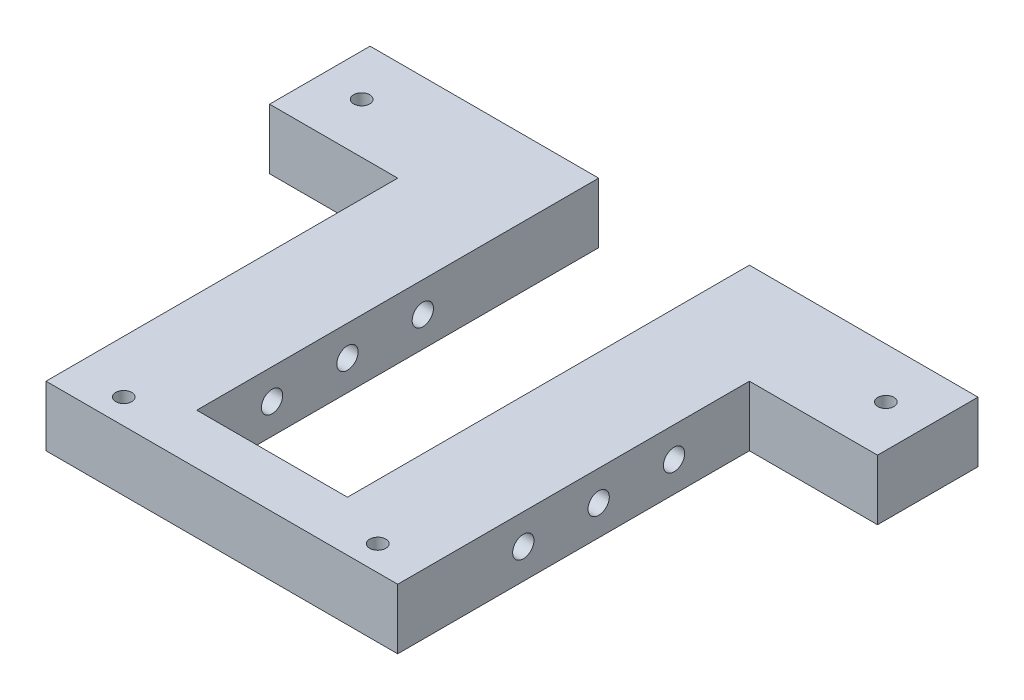
ISO-10303-21;
HEADER;
FILE_DESCRIPTION(('STEP AP214'),'2;1');
FILE_NAME('part.step','',(''),(''),'','','');
FILE_SCHEMA(('AUTOMOTIVE_DESIGN { 1 0 10303 214 1 1 1 1 }'));
ENDSEC;
DATA;
#1=APPLICATION_CONTEXT('core data for automotive mechanical design processes');
#2=APPLICATION_PROTOCOL_DEFINITION('international standard','automotive_design',2000,#1);
#3=PRODUCT_CONTEXT('',#1,'mechanical');
#4=PRODUCT('Part','Part','',(#3));
#5=PRODUCT_RELATED_PRODUCT_CATEGORY('part','',(#4));
#6=PRODUCT_DEFINITION_FORMATION('','',#4);
#7=PRODUCT_DEFINITION_CONTEXT('part definition',#1,'design');
#8=PRODUCT_DEFINITION('design','',#6,#7);
#9=PRODUCT_DEFINITION_SHAPE('','',#8);
#10=(LENGTH_UNIT() NAMED_UNIT(*) SI_UNIT(.MILLI.,.METRE.));
#11=(NAMED_UNIT(*) PLANE_ANGLE_UNIT() SI_UNIT($,.RADIAN.));
#12=(NAMED_UNIT(*) SI_UNIT($,.STERADIAN.) SOLID_ANGLE_UNIT());
#13=UNCERTAINTY_MEASURE_WITH_UNIT(LENGTH_MEASURE(1.E-05),#10,'distance_accuracy_value','');
#14=(GEOMETRIC_REPRESENTATION_CONTEXT(3) GLOBAL_UNCERTAINTY_ASSIGNED_CONTEXT((#13)) GLOBAL_UNIT_ASSIGNED_CONTEXT((#10,
#11,#12)) REPRESENTATION_CONTEXT('',''));
#15=CARTESIAN_POINT('',(0.,0.,0.));
#16=DIRECTION('',(0.,0.,1.));
#17=DIRECTION('',(1.,0.,0.));
#18=AXIS2_PLACEMENT_3D('',#15,#16,#17);
#19=CARTESIAN_POINT('',(-109.75,-294.201790443842,-45.));
#20=DIRECTION('',(1.,0.,0.));
#21=DIRECTION('',(0.,0.,-1.));
#22=AXIS2_PLACEMENT_3D('',#19,#20,#21);
#23=PLANE('',#22);
#24=CARTESIAN_POINT('',(-109.75,-59.,-22.5));
#25=DIRECTION('',(-1.,0.,0.));
#26=DIRECTION('',(0.,0.,1.));
#27=AXIS2_PLACEMENT_3D('',#24,#25,#26);
#28=CIRCLE('',#27,3.175);
#29=CARTESIAN_POINT('',(-109.75,-59.,-19.325));
#30=VERTEX_POINT('',#29);
#31=EDGE_CURVE('E208',#30,#30,#28,.T.);
#32=ORIENTED_EDGE('',*,*,#31,.F.);
#33=EDGE_LOOP('',(#32));
#34=FACE_BOUND('',#33,.T.);
#35=CARTESIAN_POINT('',(-109.75,-59.,0.));
#36=DIRECTION('',(-1.,0.,0.));
#37=DIRECTION('',(0.,0.,1.));
#38=AXIS2_PLACEMENT_3D('',#35,#36,#37);
#39=CIRCLE('',#38,3.175);
#40=CARTESIAN_POINT('',(-109.75,-59.,3.175));
#41=VERTEX_POINT('',#40);
#42=EDGE_CURVE('E245',#41,#41,#39,.T.);
#43=ORIENTED_EDGE('',*,*,#42,.F.);
#44=EDGE_LOOP('',(#43));
#45=FACE_BOUND('',#44,.T.);
#46=CARTESIAN_POINT('',(-109.75,-58.9999999999999,22.5));
#47=DIRECTION('',(-1.,0.,0.));
#48=DIRECTION('',(0.,0.,1.));
#49=AXIS2_PLACEMENT_3D('',#46,#47,#48);
#50=CIRCLE('',#49,3.175);
#51=CARTESIAN_POINT('',(-109.75,-58.9999999999999,25.675));
#52=VERTEX_POINT('',#51);
#53=EDGE_CURVE('E242',#52,#52,#50,.T.);
#54=ORIENTED_EDGE('',*,*,#53,.F.);
#55=EDGE_LOOP('',(#54));
#56=FACE_BOUND('',#55,.T.);
#57=DIRECTION('',(0.,1.,0.));
#58=VECTOR('',#57,1.);
#59=CARTESIAN_POINT('',(-109.75,-294.201790443842,-45.));
#60=LINE('',#59,#58);
#61=CARTESIAN_POINT('',(-109.75,-68.,-45.));
#62=VERTEX_POINT('',#61);
#63=CARTESIAN_POINT('',(-109.75,-50.,-45.));
#64=VERTEX_POINT('',#63);
#65=EDGE_CURVE('E188',#62,#64,#60,.T.);
#66=ORIENTED_EDGE('',*,*,#65,.F.);
#67=DIRECTION('',(0.,0.,1.));
#68=VECTOR('',#67,1.);
#69=CARTESIAN_POINT('',(-109.75,-68.,-45.));
#70=LINE('',#69,#68);
#71=CARTESIAN_POINT('',(-109.75,-68.,60.));
#72=VERTEX_POINT('',#71);
#73=EDGE_CURVE('E279',#62,#72,#70,.T.);
#74=ORIENTED_EDGE('',*,*,#73,.T.);
#75=DIRECTION('',(0.,1.,0.));
#76=VECTOR('',#75,1.);
#77=CARTESIAN_POINT('',(-109.75,-294.201790443842,60.));
#78=LINE('',#77,#76);
#79=CARTESIAN_POINT('',(-109.75,-50.,60.));
#80=VERTEX_POINT('',#79);
#81=EDGE_CURVE('E190',#72,#80,#78,.T.);
#82=ORIENTED_EDGE('',*,*,#81,.T.);
#83=DIRECTION('',(0.,0.,-1.));
#84=VECTOR('',#83,1.);
#85=CARTESIAN_POINT('',(-109.75,-50.,-45.));
#86=LINE('',#85,#84);
#87=EDGE_CURVE('E167',#80,#64,#86,.T.);
#88=ORIENTED_EDGE('',*,*,#87,.T.);
#89=EDGE_LOOP('',(#66,#74,#82,#88));
#90=FACE_BOUND('',#89,.T.);
#91=ADVANCED_FACE('F36',(#34,#45,#56,#90),#23,.F.);
#92=CARTESIAN_POINT('',(0.,-50.,0.));
#93=DIRECTION('',(0.,-1.,0.));
#94=DIRECTION('',(0.,0.,-1.));
#95=AXIS2_PLACEMENT_3D('',#92,#93,#94);
#96=PLANE('',#95);
#97=CARTESIAN_POINT('',(21.,-50.,-60.));
#98=DIRECTION('',(0.,-1.,0.));
#99=DIRECTION('',(0.,0.,-1.));
#100=AXIS2_PLACEMENT_3D('',#97,#98,#99);
#101=CIRCLE('',#100,2.4);
#102=CARTESIAN_POINT('',(21.,-50.,-62.4));
#103=VERTEX_POINT('',#102);
#104=EDGE_CURVE('E239',#103,#103,#101,.T.);
#105=ORIENTED_EDGE('',*,*,#104,.T.);
#106=EDGE_LOOP('',(#105));
#107=FACE_BOUND('',#106,.T.);
#108=CARTESIAN_POINT('',(-18.2083333333334,-50.,52.5));
#109=DIRECTION('',(0.,-1.,0.));
#110=DIRECTION('',(0.,0.,-1.));
#111=AXIS2_PLACEMENT_3D('',#108,#109,#110);
#112=CIRCLE('',#111,2.4);
#113=CARTESIAN_POINT('',(-18.2083333333334,-50.,50.1));
#114=VERTEX_POINT('',#113);
#115=EDGE_CURVE('E225',#114,#114,#112,.T.);
#116=ORIENTED_EDGE('',*,*,#115,.T.);
#117=EDGE_LOOP('',(#116));
#118=FACE_BOUND('',#117,.T.);
#119=CARTESIAN_POINT('',(-94.0416666666667,-50.,52.5));
#120=DIRECTION('',(0.,-1.,0.));
#121=DIRECTION('',(0.,0.,-1.));
#122=AXIS2_PLACEMENT_3D('',#119,#120,#121);
#123=CIRCLE('',#122,2.4);
#124=CARTESIAN_POINT('',(-94.0416666666667,-50.,50.1));
#125=VERTEX_POINT('',#124);
#126=EDGE_CURVE('E222',#125,#125,#123,.T.);
#127=ORIENTED_EDGE('',*,*,#126,.T.);
#128=EDGE_LOOP('',(#127));
#129=FACE_BOUND('',#128,.T.);
#130=CARTESIAN_POINT('',(-135.5,-50.,-60.));
#131=DIRECTION('',(0.,-1.,0.));
#132=DIRECTION('',(0.,0.,-1.));
#133=AXIS2_PLACEMENT_3D('',#130,#131,#132);
#134=CIRCLE('',#133,2.4);
#135=CARTESIAN_POINT('',(-135.5,-50.,-62.4));
#136=VERTEX_POINT('',#135);
#137=EDGE_CURVE('E228',#136,#136,#134,.T.);
#138=ORIENTED_EDGE('',*,*,#137,.T.);
#139=EDGE_LOOP('',(#138));
#140=FACE_BOUND('',#139,.T.);
#141=DIRECTION('',(1.,0.,0.));
#142=VECTOR('',#141,1.);
#143=CARTESIAN_POINT('',(-34.75,-50.,45.));
#144=LINE('',#143,#142);
#145=CARTESIAN_POINT('',(-79.75,-50.,45.));
#146=VERTEX_POINT('',#145);
#147=CARTESIAN_POINT('',(-34.75,-50.,45.));
#148=VERTEX_POINT('',#147);
#149=EDGE_CURVE('E139',#146,#148,#144,.T.);
#150=ORIENTED_EDGE('',*,*,#149,.F.);
#151=DIRECTION('',(0.,0.,1.));
#152=VECTOR('',#151,1.);
#153=CARTESIAN_POINT('',(-79.75,-50.,45.));
#154=LINE('',#153,#152);
#155=CARTESIAN_POINT('',(-79.75,-50.,-75.));
#156=VERTEX_POINT('',#155);
#157=EDGE_CURVE('E179',#156,#146,#154,.T.);
#158=ORIENTED_EDGE('',*,*,#157,.F.);
#159=DIRECTION('',(1.,0.,0.));
#160=VECTOR('',#159,1.);
#161=CARTESIAN_POINT('',(-79.75,-50.,-75.));
#162=LINE('',#161,#160);
#163=CARTESIAN_POINT('',(-148.,-50.,-75.));
#164=VERTEX_POINT('',#163);
#165=EDGE_CURVE('E176',#164,#156,#162,.T.);
#166=ORIENTED_EDGE('',*,*,#165,.F.);
#167=DIRECTION('',(0.,0.,-1.));
#168=VECTOR('',#167,1.);
#169=CARTESIAN_POINT('',(-148.,-50.,-45.));
#170=LINE('',#169,#168);
#171=CARTESIAN_POINT('',(-148.,-50.,-45.));
#172=VERTEX_POINT('',#171);
#173=EDGE_CURVE('E173',#172,#164,#170,.T.);
#174=ORIENTED_EDGE('',*,*,#173,.F.);
#175=DIRECTION('',(-1.,0.,0.));
#176=VECTOR('',#175,1.);
#177=CARTESIAN_POINT('',(-109.75,-50.,-45.));
#178=LINE('',#177,#176);
#179=EDGE_CURVE('E170',#64,#172,#178,.T.);
#180=ORIENTED_EDGE('',*,*,#179,.F.);
#181=ORIENTED_EDGE('',*,*,#87,.F.);
#182=DIRECTION('',(-1.,0.,0.));
#183=VECTOR('',#182,1.);
#184=CARTESIAN_POINT('',(-4.75000000000007,-50.,60.));
#185=LINE('',#184,#183);
#186=CARTESIAN_POINT('',(-4.75000000000007,-50.,60.));
#187=VERTEX_POINT('',#186);
#188=EDGE_CURVE('E164',#187,#80,#185,.T.);
#189=ORIENTED_EDGE('',*,*,#188,.F.);
#190=DIRECTION('',(0.,0.,1.));
#191=VECTOR('',#190,1.);
#192=CARTESIAN_POINT('',(-4.75,-50.,-45.));
#193=LINE('',#192,#191);
#194=CARTESIAN_POINT('',(-4.75,-50.,-45.));
#195=VERTEX_POINT('',#194);
#196=EDGE_CURVE('E161',#195,#187,#193,.T.);
#197=ORIENTED_EDGE('',*,*,#196,.F.);
#198=DIRECTION('',(-1.,0.,0.));
#199=VECTOR('',#198,1.);
#200=CARTESIAN_POINT('',(-4.75,-50.,-45.));
#201=LINE('',#200,#199);
#202=CARTESIAN_POINT('',(33.5,-50.,-45.));
#203=VERTEX_POINT('',#202);
#204=EDGE_CURVE('E158',#203,#195,#201,.T.);
#205=ORIENTED_EDGE('',*,*,#204,.F.);
#206=DIRECTION('',(0.,0.,1.));
#207=VECTOR('',#206,1.);
#208=CARTESIAN_POINT('',(33.5,-50.,-45.));
#209=LINE('',#208,#207);
#210=CARTESIAN_POINT('',(33.5,-50.,-75.));
#211=VERTEX_POINT('',#210);
#212=EDGE_CURVE('E155',#211,#203,#209,.T.);
#213=ORIENTED_EDGE('',*,*,#212,.F.);
#214=DIRECTION('',(1.,0.,0.));
#215=VECTOR('',#214,1.);
#216=CARTESIAN_POINT('',(-34.75,-50.,-75.));
#217=LINE('',#216,#215);
#218=CARTESIAN_POINT('',(-34.75,-50.,-75.));
#219=VERTEX_POINT('',#218);
#220=EDGE_CURVE('E142',#219,#211,#217,.T.);
#221=ORIENTED_EDGE('',*,*,#220,.F.);
#222=DIRECTION('',(0.,0.,-1.));
#223=VECTOR('',#222,1.);
#224=CARTESIAN_POINT('',(-34.75,-50.,-45.));
#225=LINE('',#224,#223);
#226=EDGE_CURVE('E128',#148,#219,#225,.T.);
#227=ORIENTED_EDGE('',*,*,#226,.F.);
#228=EDGE_LOOP('',(#150,#158,#166,#174,#180,#181,#189,#197,#205,#213,#221,#227));
#229=FACE_BOUND('',#228,.T.);
#230=ADVANCED_FACE('F137',(#107,#118,#129,#140,#229),#96,.F.);
#231=CARTESIAN_POINT('',(-79.75,-294.201790443842,45.));
#232=DIRECTION('',(-1.,0.,0.));
#233=DIRECTION('',(0.,0.,1.));
#234=AXIS2_PLACEMENT_3D('',#231,#232,#233);
#235=PLANE('',#234);
#236=CARTESIAN_POINT('',(-79.75,-59.,-22.5));
#237=DIRECTION('',(-1.,0.,0.));
#238=DIRECTION('',(0.,0.,1.));
#239=AXIS2_PLACEMENT_3D('',#236,#237,#238);
#240=CIRCLE('',#239,3.175);
#241=CARTESIAN_POINT('',(-79.75,-59.,-19.325));
#242=VERTEX_POINT('',#241);
#243=EDGE_CURVE('E260',#242,#242,#240,.T.);
#244=ORIENTED_EDGE('',*,*,#243,.T.);
#245=EDGE_LOOP('',(#244));
#246=FACE_BOUND('',#245,.T.);
#247=CARTESIAN_POINT('',(-79.75,-59.,0.));
#248=DIRECTION('',(-1.,0.,0.));
#249=DIRECTION('',(0.,0.,1.));
#250=AXIS2_PLACEMENT_3D('',#247,#248,#249);
#251=CIRCLE('',#250,3.175);
#252=CARTESIAN_POINT('',(-79.75,-59.,3.175));
#253=VERTEX_POINT('',#252);
#254=EDGE_CURVE('E218',#253,#253,#251,.T.);
#255=ORIENTED_EDGE('',*,*,#254,.T.);
#256=EDGE_LOOP('',(#255));
#257=FACE_BOUND('',#256,.T.);
#258=CARTESIAN_POINT('',(-79.75,-58.9999999999999,22.5));
#259=DIRECTION('',(-1.,0.,0.));
#260=DIRECTION('',(0.,0.,1.));
#261=AXIS2_PLACEMENT_3D('',#258,#259,#260);
#262=CIRCLE('',#261,3.175);
#263=CARTESIAN_POINT('',(-79.75,-58.9999999999999,25.675));
#264=VERTEX_POINT('',#263);
#265=EDGE_CURVE('E213',#264,#264,#262,.T.);
#266=ORIENTED_EDGE('',*,*,#265,.T.);
#267=EDGE_LOOP('',(#266));
#268=FACE_BOUND('',#267,.T.);
#269=DIRECTION('',(0.,1.,0.));
#270=VECTOR('',#269,1.);
#271=CARTESIAN_POINT('',(-79.75,-294.201790443842,45.));
#272=LINE('',#271,#270);
#273=CARTESIAN_POINT('',(-79.75,-68.,45.));
#274=VERTEX_POINT('',#273);
#275=EDGE_CURVE('E145',#274,#146,#272,.T.);
#276=ORIENTED_EDGE('',*,*,#275,.F.);
#277=DIRECTION('',(0.,0.,-1.));
#278=VECTOR('',#277,1.);
#279=CARTESIAN_POINT('',(-79.75,-68.,45.));
#280=LINE('',#279,#278);
#281=CARTESIAN_POINT('',(-79.75,-68.,-75.));
#282=VERTEX_POINT('',#281);
#283=EDGE_CURVE('E132',#274,#282,#280,.T.);
#284=ORIENTED_EDGE('',*,*,#283,.T.);
#285=DIRECTION('',(0.,1.,0.));
#286=VECTOR('',#285,1.);
#287=CARTESIAN_POINT('',(-79.75,-294.201790443842,-75.));
#288=LINE('',#287,#286);
#289=EDGE_CURVE('E182',#282,#156,#288,.T.);
#290=ORIENTED_EDGE('',*,*,#289,.T.);
#291=ORIENTED_EDGE('',*,*,#157,.T.);
#292=EDGE_LOOP('',(#276,#284,#290,#291));
#293=FACE_BOUND('',#292,.T.);
#294=ADVANCED_FACE('F328',(#246,#257,#268,#293),#235,.F.);
#295=CARTESIAN_POINT('',(-79.75,-294.201790443842,-75.));
#296=DIRECTION('',(0.,0.,1.));
#297=DIRECTION('',(1.,0.,0.));
#298=AXIS2_PLACEMENT_3D('',#295,#296,#297);
#299=PLANE('',#298);
#300=ORIENTED_EDGE('',*,*,#289,.F.);
#301=DIRECTION('',(-1.,0.,0.));
#302=VECTOR('',#301,1.);
#303=CARTESIAN_POINT('',(-79.75,-68.,-75.));
#304=LINE('',#303,#302);
#305=CARTESIAN_POINT('',(-148.,-68.,-75.));
#306=VERTEX_POINT('',#305);
#307=EDGE_CURVE('E203',#282,#306,#304,.T.);
#308=ORIENTED_EDGE('',*,*,#307,.T.);
#309=DIRECTION('',(0.,1.,0.));
#310=VECTOR('',#309,1.);
#311=CARTESIAN_POINT('',(-148.,-294.201790443842,-75.));
#312=LINE('',#311,#310);
#313=EDGE_CURVE('E184',#306,#164,#312,.T.);
#314=ORIENTED_EDGE('',*,*,#313,.T.);
#315=ORIENTED_EDGE('',*,*,#165,.T.);
#316=EDGE_LOOP('',(#300,#308,#314,#315));
#317=FACE_BOUND('',#316,.T.);
#318=ADVANCED_FACE('F325',(#317),#299,.F.);
#319=CARTESIAN_POINT('',(-148.,-294.201790443842,-45.));
#320=DIRECTION('',(1.,0.,0.));
#321=DIRECTION('',(0.,0.,-1.));
#322=AXIS2_PLACEMENT_3D('',#319,#320,#321);
#323=PLANE('',#322);
#324=ORIENTED_EDGE('',*,*,#313,.F.);
#325=DIRECTION('',(0.,0.,1.));
#326=VECTOR('',#325,1.);
#327=CARTESIAN_POINT('',(-148.,-68.,-45.));
#328=LINE('',#327,#326);
#329=CARTESIAN_POINT('',(-148.,-68.,-45.));
#330=VERTEX_POINT('',#329);
#331=EDGE_CURVE('E273',#306,#330,#328,.T.);
#332=ORIENTED_EDGE('',*,*,#331,.T.);
#333=DIRECTION('',(0.,1.,0.));
#334=VECTOR('',#333,1.);
#335=CARTESIAN_POINT('',(-148.,-294.201790443842,-45.));
#336=LINE('',#335,#334);
#337=EDGE_CURVE('E186',#330,#172,#336,.T.);
#338=ORIENTED_EDGE('',*,*,#337,.T.);
#339=ORIENTED_EDGE('',*,*,#173,.T.);
#340=EDGE_LOOP('',(#324,#332,#338,#339));
#341=FACE_BOUND('',#340,.T.);
#342=ADVANCED_FACE('F322',(#341),#323,.F.);
#343=CARTESIAN_POINT('',(-109.75,-294.201790443842,-45.));
#344=DIRECTION('',(0.,0.,-1.));
#345=DIRECTION('',(-1.,0.,0.));
#346=AXIS2_PLACEMENT_3D('',#343,#344,#345);
#347=PLANE('',#346);
#348=ORIENTED_EDGE('',*,*,#337,.F.);
#349=DIRECTION('',(1.,0.,0.));
#350=VECTOR('',#349,1.);
#351=CARTESIAN_POINT('',(-109.75,-68.,-45.));
#352=LINE('',#351,#350);
#353=EDGE_CURVE('E276',#330,#62,#352,.T.);
#354=ORIENTED_EDGE('',*,*,#353,.T.);
#355=ORIENTED_EDGE('',*,*,#65,.T.);
#356=ORIENTED_EDGE('',*,*,#179,.T.);
#357=EDGE_LOOP('',(#348,#354,#355,#356));
#358=FACE_BOUND('',#357,.T.);
#359=ADVANCED_FACE('F318',(#358),#347,.F.);
#360=CARTESIAN_POINT('',(-4.75000000000007,-294.201790443842,60.));
#361=DIRECTION('',(0.,0.,-1.));
#362=DIRECTION('',(-1.,0.,0.));
#363=AXIS2_PLACEMENT_3D('',#360,#361,#362);
#364=PLANE('',#363);
#365=ORIENTED_EDGE('',*,*,#81,.F.);
#366=DIRECTION('',(1.,0.,0.));
#367=VECTOR('',#366,1.);
#368=CARTESIAN_POINT('',(-4.75000000000007,-68.,60.));
#369=LINE('',#368,#367);
#370=CARTESIAN_POINT('',(-4.75000000000007,-68.,60.));
#371=VERTEX_POINT('',#370);
#372=EDGE_CURVE('E282',#72,#371,#369,.T.);
#373=ORIENTED_EDGE('',*,*,#372,.T.);
#374=DIRECTION('',(0.,1.,0.));
#375=VECTOR('',#374,1.);
#376=CARTESIAN_POINT('',(-4.75000000000007,-294.201790443842,60.));
#377=LINE('',#376,#375);
#378=EDGE_CURVE('E192',#371,#187,#377,.T.);
#379=ORIENTED_EDGE('',*,*,#378,.T.);
#380=ORIENTED_EDGE('',*,*,#188,.T.);
#381=EDGE_LOOP('',(#365,#373,#379,#380));
#382=FACE_BOUND('',#381,.T.);
#383=ADVANCED_FACE('F311',(#382),#364,.F.);
#384=CARTESIAN_POINT('',(-4.75,-294.201790443842,-45.));
#385=DIRECTION('',(-1.,0.,0.));
#386=DIRECTION('',(0.,0.,1.));
#387=AXIS2_PLACEMENT_3D('',#384,#385,#386);
#388=PLANE('',#387);
#389=CARTESIAN_POINT('',(-4.75000000000001,-59.,-22.5));
#390=DIRECTION('',(-1.,0.,0.));
#391=DIRECTION('',(0.,0.,1.));
#392=AXIS2_PLACEMENT_3D('',#389,#390,#391);
#393=CIRCLE('',#392,3.175);
#394=CARTESIAN_POINT('',(-4.75000000000001,-59.,-19.325));
#395=VERTEX_POINT('',#394);
#396=EDGE_CURVE('E217',#395,#395,#393,.T.);
#397=ORIENTED_EDGE('',*,*,#396,.T.);
#398=EDGE_LOOP('',(#397));
#399=FACE_BOUND('',#398,.T.);
#400=CARTESIAN_POINT('',(-4.75000000000003,-59.,0.));
#401=DIRECTION('',(-1.,0.,0.));
#402=DIRECTION('',(0.,0.,1.));
#403=AXIS2_PLACEMENT_3D('',#400,#401,#402);
#404=CIRCLE('',#403,3.175);
#405=CARTESIAN_POINT('',(-4.75000000000003,-59.,3.175));
#406=VERTEX_POINT('',#405);
#407=EDGE_CURVE('E212',#406,#406,#404,.T.);
#408=ORIENTED_EDGE('',*,*,#407,.T.);
#409=EDGE_LOOP('',(#408));
#410=FACE_BOUND('',#409,.T.);
#411=CARTESIAN_POINT('',(-4.75000000000005,-58.9999999999999,22.5));
#412=DIRECTION('',(-1.,0.,0.));
#413=DIRECTION('',(0.,0.,1.));
#414=AXIS2_PLACEMENT_3D('',#411,#412,#413);
#415=CIRCLE('',#414,3.175);
#416=CARTESIAN_POINT('',(-4.75000000000005,-58.9999999999999,25.675));
#417=VERTEX_POINT('',#416);
#418=EDGE_CURVE('E207',#417,#417,#415,.T.);
#419=ORIENTED_EDGE('',*,*,#418,.T.);
#420=EDGE_LOOP('',(#419));
#421=FACE_BOUND('',#420,.T.);
#422=ORIENTED_EDGE('',*,*,#378,.F.);
#423=DIRECTION('',(0.,0.,-1.));
#424=VECTOR('',#423,1.);
#425=CARTESIAN_POINT('',(-4.75,-68.,-45.));
#426=LINE('',#425,#424);
#427=CARTESIAN_POINT('',(-4.75,-68.,-45.));
#428=VERTEX_POINT('',#427);
#429=EDGE_CURVE('E285',#371,#428,#426,.T.);
#430=ORIENTED_EDGE('',*,*,#429,.T.);
#431=DIRECTION('',(0.,1.,0.));
#432=VECTOR('',#431,1.);
#433=CARTESIAN_POINT('',(-4.75,-294.201790443842,-45.));
#434=LINE('',#433,#432);
#435=EDGE_CURVE('E194',#428,#195,#434,.T.);
#436=ORIENTED_EDGE('',*,*,#435,.T.);
#437=ORIENTED_EDGE('',*,*,#196,.T.);
#438=EDGE_LOOP('',(#422,#430,#436,#437));
#439=FACE_BOUND('',#438,.T.);
#440=ADVANCED_FACE('F307',(#399,#410,#421,#439),#388,.F.);
#441=CARTESIAN_POINT('',(-4.75,-294.201790443842,-45.));
#442=DIRECTION('',(0.,0.,-1.));
#443=DIRECTION('',(-1.,0.,0.));
#444=AXIS2_PLACEMENT_3D('',#441,#442,#443);
#445=PLANE('',#444);
#446=ORIENTED_EDGE('',*,*,#435,.F.);
#447=DIRECTION('',(1.,0.,0.));
#448=VECTOR('',#447,1.);
#449=CARTESIAN_POINT('',(-4.75,-68.,-45.));
#450=LINE('',#449,#448);
#451=CARTESIAN_POINT('',(33.5,-68.,-45.));
#452=VERTEX_POINT('',#451);
#453=EDGE_CURVE('E288',#428,#452,#450,.T.);
#454=ORIENTED_EDGE('',*,*,#453,.T.);
#455=DIRECTION('',(0.,1.,0.));
#456=VECTOR('',#455,1.);
#457=CARTESIAN_POINT('',(33.5,-294.201790443842,-45.));
#458=LINE('',#457,#456);
#459=EDGE_CURVE('E196',#452,#203,#458,.T.);
#460=ORIENTED_EDGE('',*,*,#459,.T.);
#461=ORIENTED_EDGE('',*,*,#204,.T.);
#462=EDGE_LOOP('',(#446,#454,#460,#461));
#463=FACE_BOUND('',#462,.T.);
#464=ADVANCED_FACE('F303',(#463),#445,.F.);
#465=CARTESIAN_POINT('',(33.5,-294.201790443842,-45.));
#466=DIRECTION('',(-1.,0.,0.));
#467=DIRECTION('',(0.,0.,1.));
#468=AXIS2_PLACEMENT_3D('',#465,#466,#467);
#469=PLANE('',#468);
#470=ORIENTED_EDGE('',*,*,#459,.F.);
#471=DIRECTION('',(0.,0.,-1.));
#472=VECTOR('',#471,1.);
#473=CARTESIAN_POINT('',(33.5,-68.,-45.));
#474=LINE('',#473,#472);
#475=CARTESIAN_POINT('',(33.5,-68.,-75.));
#476=VERTEX_POINT('',#475);
#477=EDGE_CURVE('E291',#452,#476,#474,.T.);
#478=ORIENTED_EDGE('',*,*,#477,.T.);
#479=DIRECTION('',(0.,1.,0.));
#480=VECTOR('',#479,1.);
#481=CARTESIAN_POINT('',(33.5,-294.201790443842,-75.));
#482=LINE('',#481,#480);
#483=EDGE_CURVE('E198',#476,#211,#482,.T.);
#484=ORIENTED_EDGE('',*,*,#483,.T.);
#485=ORIENTED_EDGE('',*,*,#212,.T.);
#486=EDGE_LOOP('',(#470,#478,#484,#485));
#487=FACE_BOUND('',#486,.T.);
#488=ADVANCED_FACE('F298',(#487),#469,.F.);
#489=CARTESIAN_POINT('',(-34.75,-294.201790443842,-75.));
#490=DIRECTION('',(0.,0.,1.));
#491=DIRECTION('',(1.,0.,0.));
#492=AXIS2_PLACEMENT_3D('',#489,#490,#491);
#493=PLANE('',#492);
#494=ORIENTED_EDGE('',*,*,#483,.F.);
#495=DIRECTION('',(-1.,0.,0.));
#496=VECTOR('',#495,1.);
#497=CARTESIAN_POINT('',(-34.75,-68.,-75.));
#498=LINE('',#497,#496);
#499=CARTESIAN_POINT('',(-34.75,-68.,-75.));
#500=VERTEX_POINT('',#499);
#501=EDGE_CURVE('E57',#476,#500,#498,.T.);
#502=ORIENTED_EDGE('',*,*,#501,.T.);
#503=DIRECTION('',(0.,1.,0.));
#504=VECTOR('',#503,1.);
#505=CARTESIAN_POINT('',(-34.75,-294.201790443842,-75.));
#506=LINE('',#505,#504);
#507=EDGE_CURVE('E133',#500,#219,#506,.T.);
#508=ORIENTED_EDGE('',*,*,#507,.T.);
#509=ORIENTED_EDGE('',*,*,#220,.T.);
#510=EDGE_LOOP('',(#494,#502,#508,#509));
#511=FACE_BOUND('',#510,.T.);
#512=ADVANCED_FACE('F295',(#511),#493,.F.);
#513=CARTESIAN_POINT('',(-34.75,-294.201790443842,-45.));
#514=DIRECTION('',(1.,0.,0.));
#515=DIRECTION('',(0.,0.,-1.));
#516=AXIS2_PLACEMENT_3D('',#513,#514,#515);
#517=PLANE('',#516);
#518=CARTESIAN_POINT('',(-34.75,-59.,-22.5));
#519=DIRECTION('',(1.,0.,0.));
#520=DIRECTION('',(0.,0.,-1.));
#521=AXIS2_PLACEMENT_3D('',#518,#519,#520);
#522=CIRCLE('',#521,3.175);
#523=CARTESIAN_POINT('',(-34.75,-59.,-25.675));
#524=VERTEX_POINT('',#523);
#525=EDGE_CURVE('E214',#524,#524,#522,.T.);
#526=ORIENTED_EDGE('',*,*,#525,.T.);
#527=EDGE_LOOP('',(#526));
#528=FACE_BOUND('',#527,.T.);
#529=CARTESIAN_POINT('',(-34.75,-59.,0.));
#530=DIRECTION('',(1.,0.,0.));
#531=DIRECTION('',(0.,0.,-1.));
#532=AXIS2_PLACEMENT_3D('',#529,#530,#531);
#533=CIRCLE('',#532,3.175);
#534=CARTESIAN_POINT('',(-34.75,-59.,-3.175));
#535=VERTEX_POINT('',#534);
#536=EDGE_CURVE('E209',#535,#535,#533,.T.);
#537=ORIENTED_EDGE('',*,*,#536,.T.);
#538=EDGE_LOOP('',(#537));
#539=FACE_BOUND('',#538,.T.);
#540=CARTESIAN_POINT('',(-34.75,-58.9999999999999,22.5));
#541=DIRECTION('',(1.,0.,0.));
#542=DIRECTION('',(0.,0.,-1.));
#543=AXIS2_PLACEMENT_3D('',#540,#541,#542);
#544=CIRCLE('',#543,3.175);
#545=CARTESIAN_POINT('',(-34.75,-58.9999999999999,19.325));
#546=VERTEX_POINT('',#545);
#547=EDGE_CURVE('E204',#546,#546,#544,.T.);
#548=ORIENTED_EDGE('',*,*,#547,.T.);
#549=EDGE_LOOP('',(#548));
#550=FACE_BOUND('',#549,.T.);
#551=ORIENTED_EDGE('',*,*,#507,.F.);
#552=DIRECTION('',(0.,0.,1.));
#553=VECTOR('',#552,1.);
#554=CARTESIAN_POINT('',(-34.75,-68.,-45.));
#555=LINE('',#554,#553);
#556=CARTESIAN_POINT('',(-34.75,-68.,45.));
#557=VERTEX_POINT('',#556);
#558=EDGE_CURVE('E45',#500,#557,#555,.T.);
#559=ORIENTED_EDGE('',*,*,#558,.T.);
#560=DIRECTION('',(0.,1.,0.));
#561=VECTOR('',#560,1.);
#562=CARTESIAN_POINT('',(-34.75,-294.201790443842,45.));
#563=LINE('',#562,#561);
#564=EDGE_CURVE('E125',#557,#148,#563,.T.);
#565=ORIENTED_EDGE('',*,*,#564,.T.);
#566=ORIENTED_EDGE('',*,*,#226,.T.);
#567=EDGE_LOOP('',(#551,#559,#565,#566));
#568=FACE_BOUND('',#567,.T.);
#569=ADVANCED_FACE('F127',(#528,#539,#550,#568),#517,.F.);
#570=CARTESIAN_POINT('',(-34.75,-294.201790443842,45.));
#571=DIRECTION('',(0.,0.,1.));
#572=DIRECTION('',(1.,0.,0.));
#573=AXIS2_PLACEMENT_3D('',#570,#571,#572);
#574=PLANE('',#573);
#575=ORIENTED_EDGE('',*,*,#564,.F.);
#576=DIRECTION('',(-1.,0.,0.));
#577=VECTOR('',#576,1.);
#578=CARTESIAN_POINT('',(-34.75,-68.,45.));
#579=LINE('',#578,#577);
#580=EDGE_CURVE('E11',#557,#274,#579,.T.);
#581=ORIENTED_EDGE('',*,*,#580,.T.);
#582=ORIENTED_EDGE('',*,*,#275,.T.);
#583=ORIENTED_EDGE('',*,*,#149,.T.);
#584=EDGE_LOOP('',(#575,#581,#582,#583));
#585=FACE_BOUND('',#584,.T.);
#586=ADVANCED_FACE('F38',(#585),#574,.F.);
#587=CARTESIAN_POINT('',(0.,-68.,0.));
#588=DIRECTION('',(0.,1.,0.));
#589=DIRECTION('',(0.,0.,1.));
#590=AXIS2_PLACEMENT_3D('',#587,#588,#589);
#591=PLANE('',#590);
#592=CARTESIAN_POINT('',(-94.0416666666667,-68.,52.5));
#593=DIRECTION('',(0.,-1.,0.));
#594=DIRECTION('',(0.,0.,-1.));
#595=AXIS2_PLACEMENT_3D('',#592,#593,#594);
#596=CIRCLE('',#595,3.048);
#597=CARTESIAN_POINT('',(-94.0416666666667,-68.,49.452));
#598=VERTEX_POINT('',#597);
#599=EDGE_CURVE('E263',#598,#598,#596,.T.);
#600=ORIENTED_EDGE('',*,*,#599,.F.);
#601=EDGE_LOOP('',(#600));
#602=FACE_BOUND('',#601,.T.);
#603=CARTESIAN_POINT('',(-18.2083333333334,-68.,52.5));
#604=DIRECTION('',(0.,-1.,0.));
#605=DIRECTION('',(0.,0.,-1.));
#606=AXIS2_PLACEMENT_3D('',#603,#604,#605);
#607=CIRCLE('',#606,3.048);
#608=CARTESIAN_POINT('',(-18.2083333333334,-68.,49.452));
#609=VERTEX_POINT('',#608);
#610=EDGE_CURVE('E266',#609,#609,#607,.T.);
#611=ORIENTED_EDGE('',*,*,#610,.F.);
#612=EDGE_LOOP('',(#611));
#613=FACE_BOUND('',#612,.T.);
#614=CARTESIAN_POINT('',(-135.5,-68.,-60.));
#615=DIRECTION('',(0.,-1.,0.));
#616=DIRECTION('',(0.,0.,-1.));
#617=AXIS2_PLACEMENT_3D('',#614,#615,#616);
#618=CIRCLE('',#617,3.048);
#619=CARTESIAN_POINT('',(-135.5,-68.,-63.048));
#620=VERTEX_POINT('',#619);
#621=EDGE_CURVE('E150',#620,#620,#618,.T.);
#622=ORIENTED_EDGE('',*,*,#621,.F.);
#623=EDGE_LOOP('',(#622));
#624=FACE_BOUND('',#623,.T.);
#625=CARTESIAN_POINT('',(21.,-68.,-60.));
#626=DIRECTION('',(0.,-1.,0.));
#627=DIRECTION('',(0.,0.,-1.));
#628=AXIS2_PLACEMENT_3D('',#625,#626,#627);
#629=CIRCLE('',#628,3.048);
#630=CARTESIAN_POINT('',(21.,-68.,-63.048));
#631=VERTEX_POINT('',#630);
#632=EDGE_CURVE('E147',#631,#631,#629,.T.);
#633=ORIENTED_EDGE('',*,*,#632,.F.);
#634=EDGE_LOOP('',(#633));
#635=FACE_BOUND('',#634,.T.);
#636=ORIENTED_EDGE('',*,*,#558,.F.);
#637=ORIENTED_EDGE('',*,*,#501,.F.);
#638=ORIENTED_EDGE('',*,*,#477,.F.);
#639=ORIENTED_EDGE('',*,*,#453,.F.);
#640=ORIENTED_EDGE('',*,*,#429,.F.);
#641=ORIENTED_EDGE('',*,*,#372,.F.);
#642=ORIENTED_EDGE('',*,*,#73,.F.);
#643=ORIENTED_EDGE('',*,*,#353,.F.);
#644=ORIENTED_EDGE('',*,*,#331,.F.);
#645=ORIENTED_EDGE('',*,*,#307,.F.);
#646=ORIENTED_EDGE('',*,*,#283,.F.);
#647=ORIENTED_EDGE('',*,*,#580,.F.);
#648=EDGE_LOOP('',(#636,#637,#638,#639,#640,#641,#642,#643,#644,#645,#646,#647));
#649=FACE_BOUND('',#648,.T.);
#650=ADVANCED_FACE('F299',(#602,#613,#624,#635,#649),#591,.F.);
#651=CARTESIAN_POINT('',(21.,-68.,-60.));
#652=DIRECTION('',(0.,-1.,0.));
#653=DIRECTION('',(0.,0.,-1.));
#654=AXIS2_PLACEMENT_3D('',#651,#652,#653);
#655=CONICAL_SURFACE('',#654,3.048,0.872664625997157);
#656=CARTESIAN_POINT('',(21.,-67.4562634389971,-60.));
#657=DIRECTION('',(0.,-1.,0.));
#658=DIRECTION('',(0.,0.,-1.));
#659=AXIS2_PLACEMENT_3D('',#656,#657,#658);
#660=CIRCLE('',#659,2.4);
#661=CARTESIAN_POINT('',(21.,-67.4562634389971,-62.4));
#662=VERTEX_POINT('',#661);
#663=EDGE_CURVE('E40',#662,#662,#660,.F.);
#664=ORIENTED_EDGE('',*,*,#663,.T.);
#665=EDGE_LOOP('',(#664));
#666=FACE_BOUND('',#665,.T.);
#667=ORIENTED_EDGE('',*,*,#632,.T.);
#668=EDGE_LOOP('',(#667));
#669=FACE_BOUND('',#668,.T.);
#670=ADVANCED_FACE('F450',(#666,#669),#655,.F.);
#671=CARTESIAN_POINT('',(-135.5,-68.,-60.));
#672=DIRECTION('',(0.,-1.,0.));
#673=DIRECTION('',(0.,0.,-1.));
#674=AXIS2_PLACEMENT_3D('',#671,#672,#673);
#675=CONICAL_SURFACE('',#674,3.048,0.872664625997153);
#676=CARTESIAN_POINT('',(-135.5,-67.4562634389971,-60.));
#677=DIRECTION('',(0.,-1.,0.));
#678=DIRECTION('',(0.,0.,-1.));
#679=AXIS2_PLACEMENT_3D('',#676,#677,#678);
#680=CIRCLE('',#679,2.4);
#681=CARTESIAN_POINT('',(-135.5,-67.4562634389971,-62.4));
#682=VERTEX_POINT('',#681);
#683=EDGE_CURVE('E226',#682,#682,#680,.F.);
#684=ORIENTED_EDGE('',*,*,#683,.T.);
#685=EDGE_LOOP('',(#684));
#686=FACE_BOUND('',#685,.T.);
#687=ORIENTED_EDGE('',*,*,#621,.T.);
#688=EDGE_LOOP('',(#687));
#689=FACE_BOUND('',#688,.T.);
#690=ADVANCED_FACE('F453',(#686,#689),#675,.F.);
#691=CARTESIAN_POINT('',(-18.2083333333334,-68.,52.5));
#692=DIRECTION('',(0.,-1.,0.));
#693=DIRECTION('',(0.,0.,-1.));
#694=AXIS2_PLACEMENT_3D('',#691,#692,#693);
#695=CONICAL_SURFACE('',#694,3.048,0.872664625997158);
#696=CARTESIAN_POINT('',(-18.2083333333334,-67.4562634389971,52.5));
#697=DIRECTION('',(0.,-1.,0.));
#698=DIRECTION('',(0.,0.,-1.));
#699=AXIS2_PLACEMENT_3D('',#696,#697,#698);
#700=CIRCLE('',#699,2.4);
#701=CARTESIAN_POINT('',(-18.2083333333334,-67.4562634389971,50.1));
#702=VERTEX_POINT('',#701);
#703=EDGE_CURVE('E223',#702,#702,#700,.F.);
#704=ORIENTED_EDGE('',*,*,#703,.T.);
#705=EDGE_LOOP('',(#704));
#706=FACE_BOUND('',#705,.T.);
#707=ORIENTED_EDGE('',*,*,#610,.T.);
#708=EDGE_LOOP('',(#707));
#709=FACE_BOUND('',#708,.T.);
#710=ADVANCED_FACE('F388',(#706,#709),#695,.F.);
#711=CARTESIAN_POINT('',(-94.0416666666667,-68.,52.5));
#712=DIRECTION('',(0.,-1.,0.));
#713=DIRECTION('',(0.,0.,-1.));
#714=AXIS2_PLACEMENT_3D('',#711,#712,#713);
#715=CONICAL_SURFACE('',#714,3.048,0.872664625997153);
#716=CARTESIAN_POINT('',(-94.0416666666667,-67.4562634389971,52.5));
#717=DIRECTION('',(0.,-1.,0.));
#718=DIRECTION('',(0.,0.,-1.));
#719=AXIS2_PLACEMENT_3D('',#716,#717,#718);
#720=CIRCLE('',#719,2.4);
#721=CARTESIAN_POINT('',(-94.0416666666667,-67.4562634389971,50.1));
#722=VERTEX_POINT('',#721);
#723=EDGE_CURVE('E219',#722,#722,#720,.F.);
#724=ORIENTED_EDGE('',*,*,#723,.T.);
#725=EDGE_LOOP('',(#724));
#726=FACE_BOUND('',#725,.T.);
#727=ORIENTED_EDGE('',*,*,#599,.T.);
#728=EDGE_LOOP('',(#727));
#729=FACE_BOUND('',#728,.T.);
#730=ADVANCED_FACE('F375',(#726,#729),#715,.F.);
#731=CARTESIAN_POINT('',(33.5,-58.9999999999999,22.5));
#732=DIRECTION('',(-1.,0.,0.));
#733=DIRECTION('',(0.,0.,1.));
#734=AXIS2_PLACEMENT_3D('',#731,#732,#733);
#735=CYLINDRICAL_SURFACE('',#734,3.175);
#736=ORIENTED_EDGE('',*,*,#547,.F.);
#737=EDGE_LOOP('',(#736));
#738=FACE_BOUND('',#737,.T.);
#739=ORIENTED_EDGE('',*,*,#418,.F.);
#740=EDGE_LOOP('',(#739));
#741=FACE_BOUND('',#740,.T.);
#742=ADVANCED_FACE('F371',(#738,#741),#735,.F.);
#743=CARTESIAN_POINT('',(33.5,-59.,0.));
#744=DIRECTION('',(-1.,0.,0.));
#745=DIRECTION('',(0.,0.,1.));
#746=AXIS2_PLACEMENT_3D('',#743,#744,#745);
#747=CYLINDRICAL_SURFACE('',#746,3.175);
#748=ORIENTED_EDGE('',*,*,#536,.F.);
#749=EDGE_LOOP('',(#748));
#750=FACE_BOUND('',#749,.T.);
#751=ORIENTED_EDGE('',*,*,#407,.F.);
#752=EDGE_LOOP('',(#751));
#753=FACE_BOUND('',#752,.T.);
#754=ADVANCED_FACE('F374',(#750,#753),#747,.F.);
#755=CARTESIAN_POINT('',(33.5,-59.,-22.5));
#756=DIRECTION('',(-1.,0.,0.));
#757=DIRECTION('',(0.,0.,1.));
#758=AXIS2_PLACEMENT_3D('',#755,#756,#757);
#759=CYLINDRICAL_SURFACE('',#758,3.175);
#760=ORIENTED_EDGE('',*,*,#525,.F.);
#761=EDGE_LOOP('',(#760));
#762=FACE_BOUND('',#761,.T.);
#763=ORIENTED_EDGE('',*,*,#396,.F.);
#764=EDGE_LOOP('',(#763));
#765=FACE_BOUND('',#764,.T.);
#766=ADVANCED_FACE('F384',(#762,#765),#759,.F.);
#767=ORIENTED_EDGE('',*,*,#53,.T.);
#768=EDGE_LOOP('',(#767));
#769=FACE_BOUND('',#768,.T.);
#770=ORIENTED_EDGE('',*,*,#265,.F.);
#771=EDGE_LOOP('',(#770));
#772=FACE_BOUND('',#771,.T.);
#773=ADVANCED_FACE('F377',(#769,#772),#735,.F.);
#774=ORIENTED_EDGE('',*,*,#42,.T.);
#775=EDGE_LOOP('',(#774));
#776=FACE_BOUND('',#775,.T.);
#777=ORIENTED_EDGE('',*,*,#254,.F.);
#778=EDGE_LOOP('',(#777));
#779=FACE_BOUND('',#778,.T.);
#780=ADVANCED_FACE('F387',(#776,#779),#747,.F.);
#781=ORIENTED_EDGE('',*,*,#31,.T.);
#782=EDGE_LOOP('',(#781));
#783=FACE_BOUND('',#782,.T.);
#784=ORIENTED_EDGE('',*,*,#243,.F.);
#785=EDGE_LOOP('',(#784));
#786=FACE_BOUND('',#785,.T.);
#787=ADVANCED_FACE('F397',(#783,#786),#759,.F.);
#788=CARTESIAN_POINT('',(-94.0416666666667,12.,52.5));
#789=DIRECTION('',(0.,-1.,0.));
#790=DIRECTION('',(0.,0.,-1.));
#791=AXIS2_PLACEMENT_3D('',#788,#789,#790);
#792=CYLINDRICAL_SURFACE('',#791,2.4);
#793=ORIENTED_EDGE('',*,*,#723,.F.);
#794=EDGE_LOOP('',(#793));
#795=FACE_BOUND('',#794,.T.);
#796=ORIENTED_EDGE('',*,*,#126,.F.);
#797=EDGE_LOOP('',(#796));
#798=FACE_BOUND('',#797,.T.);
#799=ADVANCED_FACE('F411',(#795,#798),#792,.F.);
#800=CARTESIAN_POINT('',(-18.2083333333334,12.,52.5));
#801=DIRECTION('',(0.,-1.,0.));
#802=DIRECTION('',(0.,0.,-1.));
#803=AXIS2_PLACEMENT_3D('',#800,#801,#802);
#804=CYLINDRICAL_SURFACE('',#803,2.4);
#805=ORIENTED_EDGE('',*,*,#703,.F.);
#806=EDGE_LOOP('',(#805));
#807=FACE_BOUND('',#806,.T.);
#808=ORIENTED_EDGE('',*,*,#115,.F.);
#809=EDGE_LOOP('',(#808));
#810=FACE_BOUND('',#809,.T.);
#811=ADVANCED_FACE('F416',(#807,#810),#804,.F.);
#812=CARTESIAN_POINT('',(-135.5,12.,-60.));
#813=DIRECTION('',(0.,-1.,0.));
#814=DIRECTION('',(0.,0.,-1.));
#815=AXIS2_PLACEMENT_3D('',#812,#813,#814);
#816=CYLINDRICAL_SURFACE('',#815,2.4);
#817=ORIENTED_EDGE('',*,*,#683,.F.);
#818=EDGE_LOOP('',(#817));
#819=FACE_BOUND('',#818,.T.);
#820=ORIENTED_EDGE('',*,*,#137,.F.);
#821=EDGE_LOOP('',(#820));
#822=FACE_BOUND('',#821,.T.);
#823=ADVANCED_FACE('F424',(#819,#822),#816,.F.);
#824=CARTESIAN_POINT('',(21.,12.,-60.));
#825=DIRECTION('',(0.,-1.,0.));
#826=DIRECTION('',(0.,0.,-1.));
#827=AXIS2_PLACEMENT_3D('',#824,#825,#826);
#828=CYLINDRICAL_SURFACE('',#827,2.4);
#829=ORIENTED_EDGE('',*,*,#663,.F.);
#830=EDGE_LOOP('',(#829));
#831=FACE_BOUND('',#830,.T.);
#832=ORIENTED_EDGE('',*,*,#104,.F.);
#833=EDGE_LOOP('',(#832));
#834=FACE_BOUND('',#833,.T.);
#835=ADVANCED_FACE('F431',(#831,#834),#828,.F.);
#836=CLOSED_SHELL('',(#91,#230,#294,#318,#342,#359,#383,#440,#464,#488,#512,#569,#586,#650,#670,
#690,#710,#730,#742,#754,#766,#773,#780,#787,#799,#811,#823,#835));
#837=MANIFOLD_SOLID_BREP('B2',#836);
#838=ADVANCED_BREP_SHAPE_REPRESENTATION('',(#18,#837),#14);
#839=SHAPE_DEFINITION_REPRESENTATION(#9,#838);
ENDSEC;
END-ISO-10303-21;
